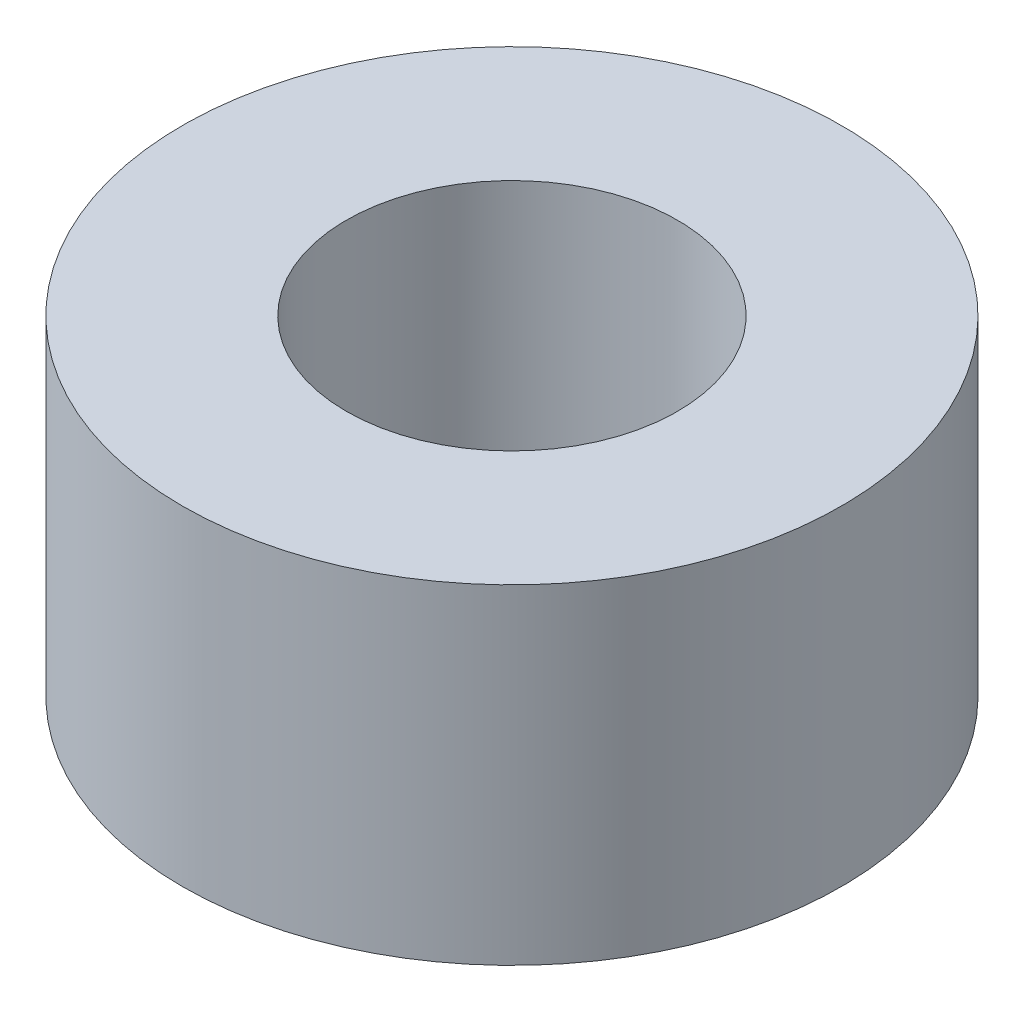
ISO-10303-21;
HEADER;
FILE_DESCRIPTION(('STEP AP214'),'2;1');
FILE_NAME('part.step','',(''),(''),'','','');
FILE_SCHEMA(('AUTOMOTIVE_DESIGN { 1 0 10303 214 1 1 1 1 }'));
ENDSEC;
DATA;
#1=APPLICATION_CONTEXT('core data for automotive mechanical design processes');
#2=APPLICATION_PROTOCOL_DEFINITION('international standard','automotive_design',2000,#1);
#3=PRODUCT_CONTEXT('',#1,'mechanical');
#4=PRODUCT('Part','Part','',(#3));
#5=PRODUCT_RELATED_PRODUCT_CATEGORY('part','',(#4));
#6=PRODUCT_DEFINITION_FORMATION('','',#4);
#7=PRODUCT_DEFINITION_CONTEXT('part definition',#1,'design');
#8=PRODUCT_DEFINITION('design','',#6,#7);
#9=PRODUCT_DEFINITION_SHAPE('','',#8);
#10=(LENGTH_UNIT() NAMED_UNIT(*) SI_UNIT(.MILLI.,.METRE.));
#11=(NAMED_UNIT(*) PLANE_ANGLE_UNIT() SI_UNIT($,.RADIAN.));
#12=(NAMED_UNIT(*) SI_UNIT($,.STERADIAN.) SOLID_ANGLE_UNIT());
#13=UNCERTAINTY_MEASURE_WITH_UNIT(LENGTH_MEASURE(1.E-05),#10,'distance_accuracy_value','');
#14=(GEOMETRIC_REPRESENTATION_CONTEXT(3) GLOBAL_UNCERTAINTY_ASSIGNED_CONTEXT((#13)) GLOBAL_UNIT_ASSIGNED_CONTEXT((#10,
#11,#12)) REPRESENTATION_CONTEXT('',''));
#15=CARTESIAN_POINT('',(0.,0.,0.));
#16=DIRECTION('',(0.,0.,1.));
#17=DIRECTION('',(1.,0.,0.));
#18=AXIS2_PLACEMENT_3D('',#15,#16,#17);
#19=CARTESIAN_POINT('',(0.,10.,0.));
#20=DIRECTION('',(0.,-1.,0.));
#21=DIRECTION('',(0.,0.,-1.));
#22=AXIS2_PLACEMENT_3D('',#19,#20,#21);
#23=CYLINDRICAL_SURFACE('',#22,10.);
#24=CARTESIAN_POINT('',(0.,10.,0.));
#25=DIRECTION('',(0.,1.,0.));
#26=DIRECTION('',(0.,0.,1.));
#27=AXIS2_PLACEMENT_3D('',#24,#25,#26);
#28=CIRCLE('',#27,10.);
#29=CARTESIAN_POINT('',(0.,10.,10.));
#30=VERTEX_POINT('',#29);
#31=EDGE_CURVE('E10',#30,#30,#28,.T.);
#32=ORIENTED_EDGE('',*,*,#31,.F.);
#33=EDGE_LOOP('',(#32));
#34=FACE_BOUND('',#33,.T.);
#35=CARTESIAN_POINT('',(0.,0.,0.));
#36=DIRECTION('',(0.,1.,0.));
#37=DIRECTION('',(0.,0.,1.));
#38=AXIS2_PLACEMENT_3D('',#35,#36,#37);
#39=CIRCLE('',#38,10.);
#40=CARTESIAN_POINT('',(0.,0.,10.));
#41=VERTEX_POINT('',#40);
#42=EDGE_CURVE('E40',#41,#41,#39,.T.);
#43=ORIENTED_EDGE('',*,*,#42,.T.);
#44=EDGE_LOOP('',(#43));
#45=FACE_BOUND('',#44,.T.);
#46=ADVANCED_FACE('F37',(#34,#45),#23,.T.);
#47=CARTESIAN_POINT('',(0.,10.,0.));
#48=DIRECTION('',(0.,1.,0.));
#49=DIRECTION('',(0.,0.,1.));
#50=AXIS2_PLACEMENT_3D('',#47,#48,#49);
#51=PLANE('',#50);
#52=CARTESIAN_POINT('',(0.,10.,0.));
#53=DIRECTION('',(0.,1.,0.));
#54=DIRECTION('',(0.,0.,1.));
#55=AXIS2_PLACEMENT_3D('',#52,#53,#54);
#56=CIRCLE('',#55,5.025);
#57=CARTESIAN_POINT('',(0.,10.,5.025));
#58=VERTEX_POINT('',#57);
#59=EDGE_CURVE('E49',#58,#58,#56,.T.);
#60=ORIENTED_EDGE('',*,*,#59,.F.);
#61=EDGE_LOOP('',(#60));
#62=FACE_BOUND('',#61,.T.);
#63=ORIENTED_EDGE('',*,*,#31,.T.);
#64=EDGE_LOOP('',(#63));
#65=FACE_BOUND('',#64,.T.);
#66=ADVANCED_FACE('F62',(#62,#65),#51,.T.);
#67=CARTESIAN_POINT('',(0.,0.,0.));
#68=DIRECTION('',(0.,1.,0.));
#69=DIRECTION('',(0.,0.,1.));
#70=AXIS2_PLACEMENT_3D('',#67,#68,#69);
#71=PLANE('',#70);
#72=CARTESIAN_POINT('',(0.,0.,0.));
#73=DIRECTION('',(0.,1.,0.));
#74=DIRECTION('',(0.,0.,1.));
#75=AXIS2_PLACEMENT_3D('',#72,#73,#74);
#76=CIRCLE('',#75,5.025);
#77=CARTESIAN_POINT('',(0.,0.,5.025));
#78=VERTEX_POINT('',#77);
#79=EDGE_CURVE('E51',#78,#78,#76,.T.);
#80=ORIENTED_EDGE('',*,*,#79,.T.);
#81=EDGE_LOOP('',(#80));
#82=FACE_BOUND('',#81,.T.);
#83=ORIENTED_EDGE('',*,*,#42,.F.);
#84=EDGE_LOOP('',(#83));
#85=FACE_BOUND('',#84,.T.);
#86=ADVANCED_FACE('F64',(#82,#85),#71,.F.);
#87=CARTESIAN_POINT('',(0.,10.,0.));
#88=DIRECTION('',(0.,-1.,0.));
#89=DIRECTION('',(0.,0.,-1.));
#90=AXIS2_PLACEMENT_3D('',#87,#88,#89);
#91=CYLINDRICAL_SURFACE('',#90,5.025);
#92=ORIENTED_EDGE('',*,*,#59,.T.);
#93=EDGE_LOOP('',(#92));
#94=FACE_BOUND('',#93,.T.);
#95=ORIENTED_EDGE('',*,*,#79,.F.);
#96=EDGE_LOOP('',(#95));
#97=FACE_BOUND('',#96,.T.);
#98=ADVANCED_FACE('F59',(#94,#97),#91,.F.);
#99=CLOSED_SHELL('',(#46,#66,#86,#98));
#100=MANIFOLD_SOLID_BREP('B2',#99);
#101=ADVANCED_BREP_SHAPE_REPRESENTATION('',(#18,#100),#14);
#102=SHAPE_DEFINITION_REPRESENTATION(#9,#101);
ENDSEC;
END-ISO-10303-21;
